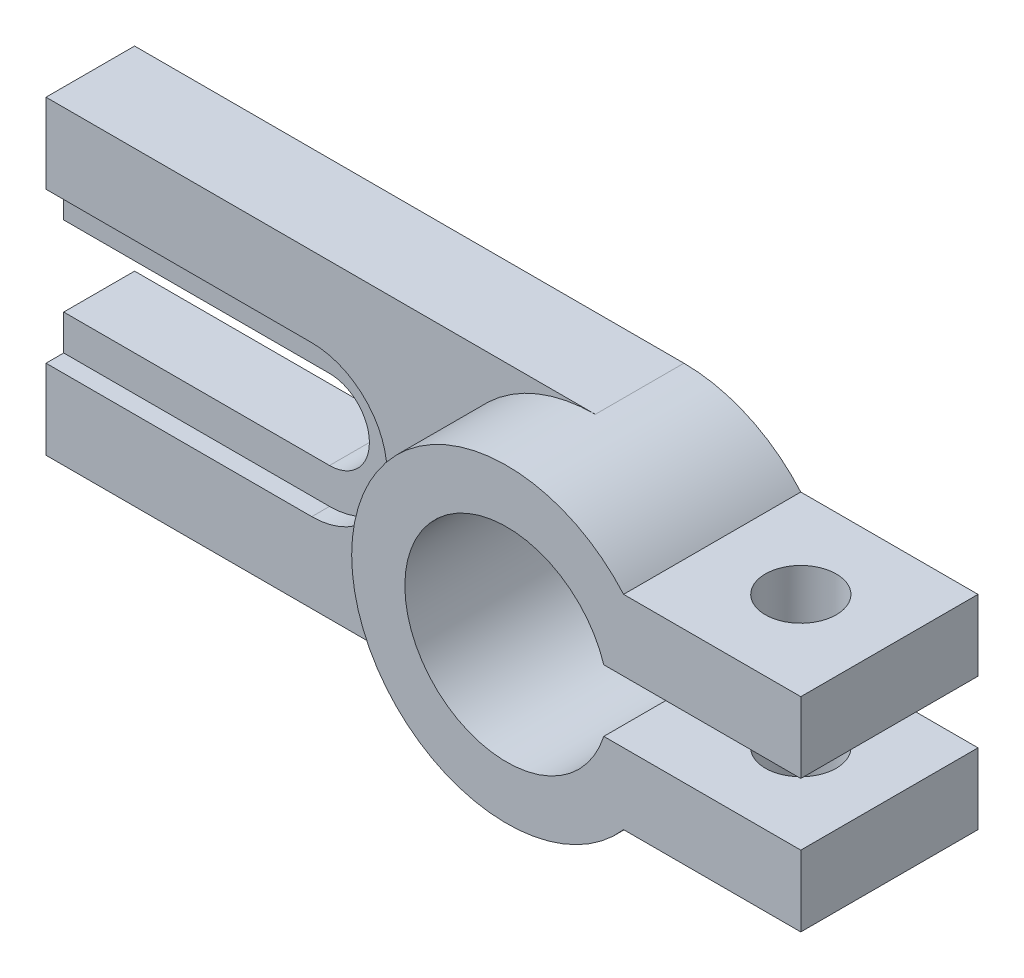
ISO-10303-21;
HEADER;
FILE_DESCRIPTION(('STEP AP214'),'2;1');
FILE_NAME('part.step','',(''),(''),'','','');
FILE_SCHEMA(('AUTOMOTIVE_DESIGN { 1 0 10303 214 1 1 1 1 }'));
ENDSEC;
DATA;
#1=APPLICATION_CONTEXT('core data for automotive mechanical design processes');
#2=APPLICATION_PROTOCOL_DEFINITION('international standard','automotive_design',2000,#1);
#3=PRODUCT_CONTEXT('',#1,'mechanical');
#4=PRODUCT('Part','Part','',(#3));
#5=PRODUCT_RELATED_PRODUCT_CATEGORY('part','',(#4));
#6=PRODUCT_DEFINITION_FORMATION('','',#4);
#7=PRODUCT_DEFINITION_CONTEXT('part definition',#1,'design');
#8=PRODUCT_DEFINITION('design','',#6,#7);
#9=PRODUCT_DEFINITION_SHAPE('','',#8);
#10=(LENGTH_UNIT() NAMED_UNIT(*) SI_UNIT(.MILLI.,.METRE.));
#11=(NAMED_UNIT(*) PLANE_ANGLE_UNIT() SI_UNIT($,.RADIAN.));
#12=(NAMED_UNIT(*) SI_UNIT($,.STERADIAN.) SOLID_ANGLE_UNIT());
#13=UNCERTAINTY_MEASURE_WITH_UNIT(LENGTH_MEASURE(1.E-05),#10,'distance_accuracy_value','');
#14=(GEOMETRIC_REPRESENTATION_CONTEXT(3) GLOBAL_UNCERTAINTY_ASSIGNED_CONTEXT((#13)) GLOBAL_UNIT_ASSIGNED_CONTEXT((#10,
#11,#12)) REPRESENTATION_CONTEXT('',''));
#15=CARTESIAN_POINT('',(0.,0.,0.));
#16=DIRECTION('',(0.,0.,1.));
#17=DIRECTION('',(1.,0.,0.));
#18=AXIS2_PLACEMENT_3D('',#15,#16,#17);
#19=CARTESIAN_POINT('',(0.,0.,10.));
#20=DIRECTION('',(0.,0.,-1.));
#21=DIRECTION('',(-1.,0.,0.));
#22=AXIS2_PLACEMENT_3D('',#19,#20,#21);
#23=PLANE('',#22);
#24=DIRECTION('',(0.,-1.,0.));
#25=VECTOR('',#24,1.);
#26=CARTESIAN_POINT('',(-62.,17.5,10.));
#27=LINE('',#26,#25);
#28=CARTESIAN_POINT('',(-62.,17.5,10.));
#29=VERTEX_POINT('',#28);
#30=CARTESIAN_POINT('',(-62.,8.5,10.));
#31=VERTEX_POINT('',#30);
#32=EDGE_CURVE('E121',#29,#31,#27,.T.);
#33=ORIENTED_EDGE('',*,*,#32,.T.);
#34=DIRECTION('',(-1.,0.,0.));
#35=VECTOR('',#34,1.);
#36=CARTESIAN_POINT('',(-62.,8.5,10.));
#37=LINE('',#36,#35);
#38=CARTESIAN_POINT('',(-32.,8.5,10.));
#39=VERTEX_POINT('',#38);
#40=EDGE_CURVE('E186',#39,#31,#37,.T.);
#41=ORIENTED_EDGE('',*,*,#40,.F.);
#42=CARTESIAN_POINT('',(-32.,0.,10.));
#43=DIRECTION('',(0.,0.,1.));
#44=DIRECTION('',(1.,0.,0.));
#45=AXIS2_PLACEMENT_3D('',#42,#43,#44);
#46=CIRCLE('',#45,8.5);
#47=CARTESIAN_POINT('',(-32.,-8.5,10.));
#48=VERTEX_POINT('',#47);
#49=EDGE_CURVE('E343',#48,#39,#46,.T.);
#50=ORIENTED_EDGE('',*,*,#49,.F.);
#51=DIRECTION('',(1.,0.,0.));
#52=VECTOR('',#51,1.);
#53=CARTESIAN_POINT('',(-62.,-8.5,10.));
#54=LINE('',#53,#52);
#55=CARTESIAN_POINT('',(-62.,-8.5,10.));
#56=VERTEX_POINT('',#55);
#57=EDGE_CURVE('E346',#56,#48,#54,.T.);
#58=ORIENTED_EDGE('',*,*,#57,.F.);
#59=DIRECTION('',(0.,-1.,0.));
#60=VECTOR('',#59,1.);
#61=CARTESIAN_POINT('',(-62.,-4.5,10.));
#62=LINE('',#61,#60);
#63=CARTESIAN_POINT('',(-62.,-17.5,10.));
#64=VERTEX_POINT('',#63);
#65=EDGE_CURVE('E338',#56,#64,#62,.T.);
#66=ORIENTED_EDGE('',*,*,#65,.T.);
#67=DIRECTION('',(1.,0.,0.));
#68=VECTOR('',#67,1.);
#69=CARTESIAN_POINT('',(-62.,-17.5,10.));
#70=LINE('',#69,#68);
#71=CARTESIAN_POINT('',(0.,-17.5,10.));
#72=VERTEX_POINT('',#71);
#73=EDGE_CURVE('E231',#64,#72,#70,.T.);
#74=ORIENTED_EDGE('',*,*,#73,.T.);
#75=CARTESIAN_POINT('',(0.,0.,10.));
#76=DIRECTION('',(0.,0.,1.));
#77=DIRECTION('',(1.,0.,0.));
#78=AXIS2_PLACEMENT_3D('',#75,#76,#77);
#79=CIRCLE('',#78,17.5);
#80=CARTESIAN_POINT('',(0.,17.5,10.));
#81=VERTEX_POINT('',#80);
#82=EDGE_CURVE('E11',#81,#72,#79,.T.);
#83=ORIENTED_EDGE('',*,*,#82,.F.);
#84=DIRECTION('',(-1.,0.,0.));
#85=VECTOR('',#84,1.);
#86=CARTESIAN_POINT('',(-62.,17.5,10.));
#87=LINE('',#86,#85);
#88=EDGE_CURVE('E260',#81,#29,#87,.T.);
#89=ORIENTED_EDGE('',*,*,#88,.T.);
#90=EDGE_LOOP('',(#33,#41,#50,#58,#66,#74,#83,#89));
#91=FACE_BOUND('',#90,.T.);
#92=ADVANCED_FACE('F32',(#91),#23,.F.);
#93=CARTESIAN_POINT('',(-62.,17.5,10.));
#94=DIRECTION('',(0.,-1.,0.));
#95=DIRECTION('',(0.,0.,-1.));
#96=AXIS2_PLACEMENT_3D('',#93,#94,#95);
#97=PLANE('',#96);
#98=DIRECTION('',(-1.,0.,0.));
#99=VECTOR('',#98,1.);
#100=CARTESIAN_POINT('',(-62.,17.5,0.));
#101=LINE('',#100,#99);
#102=CARTESIAN_POINT('',(0.,17.5,0.));
#103=VERTEX_POINT('',#102);
#104=CARTESIAN_POINT('',(-62.,17.5,0.));
#105=VERTEX_POINT('',#104);
#106=EDGE_CURVE('E220',#103,#105,#101,.T.);
#107=ORIENTED_EDGE('',*,*,#106,.T.);
#108=DIRECTION('',(0.,0.,-1.));
#109=VECTOR('',#108,1.);
#110=CARTESIAN_POINT('',(-62.,17.5,10.));
#111=LINE('',#110,#109);
#112=EDGE_CURVE('E41',#29,#105,#111,.T.);
#113=ORIENTED_EDGE('',*,*,#112,.F.);
#114=ORIENTED_EDGE('',*,*,#88,.F.);
#115=DIRECTION('',(0.,0.,-1.));
#116=VECTOR('',#115,1.);
#117=CARTESIAN_POINT('',(0.,17.5,10.));
#118=LINE('',#117,#116);
#119=EDGE_CURVE('E221',#81,#103,#118,.T.);
#120=ORIENTED_EDGE('',*,*,#119,.T.);
#121=EDGE_LOOP('',(#107,#113,#114,#120));
#122=FACE_BOUND('',#121,.T.);
#123=ADVANCED_FACE('F34',(#122),#97,.F.);
#124=CARTESIAN_POINT('',(-62.,17.5,10.));
#125=DIRECTION('',(1.,0.,0.));
#126=DIRECTION('',(0.,0.,-1.));
#127=AXIS2_PLACEMENT_3D('',#124,#125,#126);
#128=PLANE('',#127);
#129=DIRECTION('',(0.,-1.,0.));
#130=VECTOR('',#129,1.);
#131=CARTESIAN_POINT('',(-62.,4.5,8.));
#132=LINE('',#131,#130);
#133=CARTESIAN_POINT('',(-62.,8.5,8.));
#134=VERTEX_POINT('',#133);
#135=CARTESIAN_POINT('',(-62.,4.5,8.));
#136=VERTEX_POINT('',#135);
#137=EDGE_CURVE('E356',#134,#136,#132,.T.);
#138=ORIENTED_EDGE('',*,*,#137,.F.);
#139=DIRECTION('',(0.,0.,1.));
#140=VECTOR('',#139,1.);
#141=CARTESIAN_POINT('',(-62.,8.5,8.));
#142=LINE('',#141,#140);
#143=EDGE_CURVE('E318',#134,#31,#142,.T.);
#144=ORIENTED_EDGE('',*,*,#143,.T.);
#145=ORIENTED_EDGE('',*,*,#32,.F.);
#146=ORIENTED_EDGE('',*,*,#112,.T.);
#147=DIRECTION('',(0.,-1.,0.));
#148=VECTOR('',#147,1.);
#149=CARTESIAN_POINT('',(-62.,17.5,0.));
#150=LINE('',#149,#148);
#151=CARTESIAN_POINT('',(-62.,4.5,0.));
#152=VERTEX_POINT('',#151);
#153=EDGE_CURVE('E215',#105,#152,#150,.T.);
#154=ORIENTED_EDGE('',*,*,#153,.T.);
#155=DIRECTION('',(0.,0.,-1.));
#156=VECTOR('',#155,1.);
#157=CARTESIAN_POINT('',(-62.,4.5,10.));
#158=LINE('',#157,#156);
#159=EDGE_CURVE('E203',#136,#152,#158,.T.);
#160=ORIENTED_EDGE('',*,*,#159,.F.);
#161=EDGE_LOOP('',(#138,#144,#145,#146,#154,#160));
#162=FACE_BOUND('',#161,.T.);
#163=ADVANCED_FACE('F213',(#162),#128,.F.);
#164=CARTESIAN_POINT('',(-62.,4.5,10.));
#165=DIRECTION('',(0.,1.,0.));
#166=DIRECTION('',(0.,0.,1.));
#167=AXIS2_PLACEMENT_3D('',#164,#165,#166);
#168=PLANE('',#167);
#169=DIRECTION('',(0.,0.,-1.));
#170=VECTOR('',#169,1.);
#171=CARTESIAN_POINT('',(-32.,4.5,10.));
#172=LINE('',#171,#170);
#173=CARTESIAN_POINT('',(-32.,4.5,8.));
#174=VERTEX_POINT('',#173);
#175=CARTESIAN_POINT('',(-32.,4.5,0.));
#176=VERTEX_POINT('',#175);
#177=EDGE_CURVE('E201',#174,#176,#172,.T.);
#178=ORIENTED_EDGE('',*,*,#177,.F.);
#179=DIRECTION('',(1.,0.,0.));
#180=VECTOR('',#179,1.);
#181=CARTESIAN_POINT('',(-32.,4.5,8.));
#182=LINE('',#181,#180);
#183=EDGE_CURVE('E182',#136,#174,#182,.T.);
#184=ORIENTED_EDGE('',*,*,#183,.F.);
#185=ORIENTED_EDGE('',*,*,#159,.T.);
#186=DIRECTION('',(1.,0.,0.));
#187=VECTOR('',#186,1.);
#188=CARTESIAN_POINT('',(-62.,4.5,0.));
#189=LINE('',#188,#187);
#190=EDGE_CURVE('E225',#152,#176,#189,.T.);
#191=ORIENTED_EDGE('',*,*,#190,.T.);
#192=EDGE_LOOP('',(#178,#184,#185,#191));
#193=FACE_BOUND('',#192,.T.);
#194=ADVANCED_FACE('F380',(#193),#168,.F.);
#195=CARTESIAN_POINT('',(-32.,0.,10.));
#196=DIRECTION('',(0.,0.,-1.));
#197=DIRECTION('',(-1.,0.,0.));
#198=AXIS2_PLACEMENT_3D('',#195,#196,#197);
#199=CYLINDRICAL_SURFACE('',#198,4.5);
#200=DIRECTION('',(0.,0.,-1.));
#201=VECTOR('',#200,1.);
#202=CARTESIAN_POINT('',(-32.,-4.5,10.));
#203=LINE('',#202,#201);
#204=CARTESIAN_POINT('',(-32.,-4.5,8.));
#205=VERTEX_POINT('',#204);
#206=CARTESIAN_POINT('',(-32.,-4.5,0.));
#207=VERTEX_POINT('',#206);
#208=EDGE_CURVE('E192',#205,#207,#203,.T.);
#209=ORIENTED_EDGE('',*,*,#208,.F.);
#210=CARTESIAN_POINT('',(-32.,0.,8.));
#211=DIRECTION('',(0.,0.,-1.));
#212=DIRECTION('',(-1.,0.,0.));
#213=AXIS2_PLACEMENT_3D('',#210,#211,#212);
#214=CIRCLE('',#213,4.5);
#215=EDGE_CURVE('E179',#174,#205,#214,.T.);
#216=ORIENTED_EDGE('',*,*,#215,.F.);
#217=ORIENTED_EDGE('',*,*,#177,.T.);
#218=CARTESIAN_POINT('',(-32.,0.,0.));
#219=DIRECTION('',(0.,0.,-1.));
#220=DIRECTION('',(-1.,0.,0.));
#221=AXIS2_PLACEMENT_3D('',#218,#219,#220);
#222=CIRCLE('',#221,4.5);
#223=EDGE_CURVE('E199',#176,#207,#222,.T.);
#224=ORIENTED_EDGE('',*,*,#223,.T.);
#225=EDGE_LOOP('',(#209,#216,#217,#224));
#226=FACE_BOUND('',#225,.T.);
#227=ADVANCED_FACE('F197',(#226),#199,.F.);
#228=CARTESIAN_POINT('',(-32.,-4.5,10.));
#229=DIRECTION('',(0.,-1.,0.));
#230=DIRECTION('',(1.,0.,0.));
#231=AXIS2_PLACEMENT_3D('',#228,#229,#230);
#232=PLANE('',#231);
#233=DIRECTION('',(0.,0.,-1.));
#234=VECTOR('',#233,1.);
#235=CARTESIAN_POINT('',(-62.,-4.5,10.));
#236=LINE('',#235,#234);
#237=CARTESIAN_POINT('',(-62.,-4.5,8.));
#238=VERTEX_POINT('',#237);
#239=CARTESIAN_POINT('',(-62.,-4.5,0.));
#240=VERTEX_POINT('',#239);
#241=EDGE_CURVE('E194',#238,#240,#236,.T.);
#242=ORIENTED_EDGE('',*,*,#241,.F.);
#243=DIRECTION('',(-1.,0.,0.));
#244=VECTOR('',#243,1.);
#245=CARTESIAN_POINT('',(-32.,-4.5,8.));
#246=LINE('',#245,#244);
#247=EDGE_CURVE('E49',#205,#238,#246,.T.);
#248=ORIENTED_EDGE('',*,*,#247,.F.);
#249=ORIENTED_EDGE('',*,*,#208,.T.);
#250=DIRECTION('',(-1.,0.,0.));
#251=VECTOR('',#250,1.);
#252=CARTESIAN_POINT('',(-32.,-4.5,0.));
#253=LINE('',#252,#251);
#254=EDGE_CURVE('E237',#207,#240,#253,.T.);
#255=ORIENTED_EDGE('',*,*,#254,.T.);
#256=EDGE_LOOP('',(#242,#248,#249,#255));
#257=FACE_BOUND('',#256,.T.);
#258=ADVANCED_FACE('F190',(#257),#232,.F.);
#259=CARTESIAN_POINT('',(-62.,-4.5,10.));
#260=DIRECTION('',(1.,0.,0.));
#261=DIRECTION('',(0.,0.,-1.));
#262=AXIS2_PLACEMENT_3D('',#259,#260,#261);
#263=PLANE('',#262);
#264=ORIENTED_EDGE('',*,*,#65,.F.);
#265=DIRECTION('',(0.,0.,1.));
#266=VECTOR('',#265,1.);
#267=CARTESIAN_POINT('',(-62.,-8.5,8.));
#268=LINE('',#267,#266);
#269=CARTESIAN_POINT('',(-62.,-8.5,8.));
#270=VERTEX_POINT('',#269);
#271=EDGE_CURVE('E323',#270,#56,#268,.T.);
#272=ORIENTED_EDGE('',*,*,#271,.F.);
#273=DIRECTION('',(0.,-1.,0.));
#274=VECTOR('',#273,1.);
#275=CARTESIAN_POINT('',(-62.,-4.5,8.));
#276=LINE('',#275,#274);
#277=EDGE_CURVE('E195',#238,#270,#276,.T.);
#278=ORIENTED_EDGE('',*,*,#277,.F.);
#279=ORIENTED_EDGE('',*,*,#241,.T.);
#280=DIRECTION('',(0.,-1.,0.));
#281=VECTOR('',#280,1.);
#282=CARTESIAN_POINT('',(-62.,-4.5,0.));
#283=LINE('',#282,#281);
#284=CARTESIAN_POINT('',(-62.,-17.5,0.));
#285=VERTEX_POINT('',#284);
#286=EDGE_CURVE('E239',#240,#285,#283,.T.);
#287=ORIENTED_EDGE('',*,*,#286,.T.);
#288=DIRECTION('',(0.,0.,-1.));
#289=VECTOR('',#288,1.);
#290=CARTESIAN_POINT('',(-62.,-17.5,10.));
#291=LINE('',#290,#289);
#292=EDGE_CURVE('E205',#64,#285,#291,.T.);
#293=ORIENTED_EDGE('',*,*,#292,.F.);
#294=EDGE_LOOP('',(#264,#272,#278,#279,#287,#293));
#295=FACE_BOUND('',#294,.T.);
#296=ADVANCED_FACE('F428',(#295),#263,.F.);
#297=CARTESIAN_POINT('',(-62.,-17.5,10.));
#298=DIRECTION('',(0.,1.,0.));
#299=DIRECTION('',(-1.,0.,0.));
#300=AXIS2_PLACEMENT_3D('',#297,#298,#299);
#301=PLANE('',#300);
#302=DIRECTION('',(1.,0.,0.));
#303=VECTOR('',#302,1.);
#304=CARTESIAN_POINT('',(-62.,-17.5,0.));
#305=LINE('',#304,#303);
#306=CARTESIAN_POINT('',(0.,-17.5,0.));
#307=VERTEX_POINT('',#306);
#308=EDGE_CURVE('E241',#285,#307,#305,.T.);
#309=ORIENTED_EDGE('',*,*,#308,.T.);
#310=DIRECTION('',(0.,0.,-1.));
#311=VECTOR('',#310,1.);
#312=CARTESIAN_POINT('',(0.,-17.5,10.));
#313=LINE('',#312,#311);
#314=EDGE_CURVE('E285',#72,#307,#313,.T.);
#315=ORIENTED_EDGE('',*,*,#314,.F.);
#316=ORIENTED_EDGE('',*,*,#73,.F.);
#317=ORIENTED_EDGE('',*,*,#292,.T.);
#318=EDGE_LOOP('',(#309,#315,#316,#317));
#319=FACE_BOUND('',#318,.T.);
#320=ADVANCED_FACE('F292',(#319),#301,.F.);
#321=CARTESIAN_POINT('',(33.1909059582729,-11.5,10.));
#322=DIRECTION('',(0.,1.,0.));
#323=DIRECTION('',(-1.,0.,0.));
#324=AXIS2_PLACEMENT_3D('',#321,#322,#323);
#325=PLANE('',#324);
#326=CARTESIAN_POINT('',(23.1909059582729,-11.5,10.));
#327=DIRECTION('',(0.,-1.,0.));
#328=DIRECTION('',(1.,0.,0.));
#329=AXIS2_PLACEMENT_3D('',#326,#327,#328);
#330=CIRCLE('',#329,4.00000000000001);
#331=CARTESIAN_POINT('',(27.1909059582729,-11.5,10.));
#332=VERTEX_POINT('',#331);
#333=EDGE_CURVE('E620',#332,#332,#330,.T.);
#334=ORIENTED_EDGE('',*,*,#333,.F.);
#335=EDGE_LOOP('',(#334));
#336=FACE_BOUND('',#335,.T.);
#337=DIRECTION('',(1.,0.,0.));
#338=VECTOR('',#337,1.);
#339=CARTESIAN_POINT('',(33.1909059582729,-11.5,0.));
#340=LINE('',#339,#338);
#341=CARTESIAN_POINT('',(13.1909059582729,-11.5,0.));
#342=VERTEX_POINT('',#341);
#343=CARTESIAN_POINT('',(33.1909059582729,-11.5,0.));
#344=VERTEX_POINT('',#343);
#345=EDGE_CURVE('E245',#342,#344,#340,.T.);
#346=ORIENTED_EDGE('',*,*,#345,.T.);
#347=DIRECTION('',(0.,0.,-1.));
#348=VECTOR('',#347,1.);
#349=CARTESIAN_POINT('',(33.1909059582729,-11.5,10.));
#350=LINE('',#349,#348);
#351=CARTESIAN_POINT('',(33.1909059582729,-11.5,20.));
#352=VERTEX_POINT('',#351);
#353=EDGE_CURVE('E279',#352,#344,#350,.T.);
#354=ORIENTED_EDGE('',*,*,#353,.F.);
#355=DIRECTION('',(1.,0.,0.));
#356=VECTOR('',#355,1.);
#357=CARTESIAN_POINT('',(33.1909059582729,-11.5,20.));
#358=LINE('',#357,#356);
#359=CARTESIAN_POINT('',(13.1909059582729,-11.5,20.));
#360=VERTEX_POINT('',#359);
#361=EDGE_CURVE('E307',#360,#352,#358,.T.);
#362=ORIENTED_EDGE('',*,*,#361,.F.);
#363=DIRECTION('',(0.,0.,-1.));
#364=VECTOR('',#363,1.);
#365=CARTESIAN_POINT('',(13.1909059582729,-11.5,10.));
#366=LINE('',#365,#364);
#367=EDGE_CURVE('E282',#360,#342,#366,.T.);
#368=ORIENTED_EDGE('',*,*,#367,.T.);
#369=EDGE_LOOP('',(#346,#354,#362,#368));
#370=FACE_BOUND('',#369,.T.);
#371=ADVANCED_FACE('F305',(#336,#370),#325,.F.);
#372=CARTESIAN_POINT('',(33.1909059582729,-3.5,10.));
#373=DIRECTION('',(-1.,0.,0.));
#374=DIRECTION('',(0.,0.,1.));
#375=AXIS2_PLACEMENT_3D('',#372,#373,#374);
#376=PLANE('',#375);
#377=DIRECTION('',(0.,1.,0.));
#378=VECTOR('',#377,1.);
#379=CARTESIAN_POINT('',(33.1909059582729,-3.5,0.));
#380=LINE('',#379,#378);
#381=CARTESIAN_POINT('',(33.1909059582729,-3.5,0.));
#382=VERTEX_POINT('',#381);
#383=EDGE_CURVE('E247',#344,#382,#380,.T.);
#384=ORIENTED_EDGE('',*,*,#383,.T.);
#385=DIRECTION('',(0.,0.,-1.));
#386=VECTOR('',#385,1.);
#387=CARTESIAN_POINT('',(33.1909059582729,-3.5,10.));
#388=LINE('',#387,#386);
#389=CARTESIAN_POINT('',(33.1909059582729,-3.5,20.));
#390=VERTEX_POINT('',#389);
#391=EDGE_CURVE('E276',#390,#382,#388,.T.);
#392=ORIENTED_EDGE('',*,*,#391,.F.);
#393=DIRECTION('',(0.,1.,0.));
#394=VECTOR('',#393,1.);
#395=CARTESIAN_POINT('',(33.1909059582729,-3.5,20.));
#396=LINE('',#395,#394);
#397=EDGE_CURVE('E312',#352,#390,#396,.T.);
#398=ORIENTED_EDGE('',*,*,#397,.F.);
#399=ORIENTED_EDGE('',*,*,#353,.T.);
#400=EDGE_LOOP('',(#384,#392,#398,#399));
#401=FACE_BOUND('',#400,.T.);
#402=ADVANCED_FACE('F419',(#401),#376,.F.);
#403=CARTESIAN_POINT('',(10.9544511501033,-3.5,10.));
#404=DIRECTION('',(0.,-1.,0.));
#405=DIRECTION('',(0.,0.,-1.));
#406=AXIS2_PLACEMENT_3D('',#403,#404,#405);
#407=PLANE('',#406);
#408=CARTESIAN_POINT('',(23.1909059582729,-3.5,10.));
#409=DIRECTION('',(0.,-1.,0.));
#410=DIRECTION('',(0.,0.,-1.));
#411=AXIS2_PLACEMENT_3D('',#408,#409,#410);
#412=CIRCLE('',#411,4.00000000000001);
#413=CARTESIAN_POINT('',(23.1909059582729,-3.5,5.99999999999999));
#414=VERTEX_POINT('',#413);
#415=EDGE_CURVE('E361',#414,#414,#412,.T.);
#416=ORIENTED_EDGE('',*,*,#415,.T.);
#417=EDGE_LOOP('',(#416));
#418=FACE_BOUND('',#417,.T.);
#419=DIRECTION('',(-1.,0.,0.));
#420=VECTOR('',#419,1.);
#421=CARTESIAN_POINT('',(10.9544511501033,-3.5,0.));
#422=LINE('',#421,#420);
#423=CARTESIAN_POINT('',(10.9544511501033,-3.5,0.));
#424=VERTEX_POINT('',#423);
#425=EDGE_CURVE('E249',#382,#424,#422,.T.);
#426=ORIENTED_EDGE('',*,*,#425,.T.);
#427=DIRECTION('',(0.,0.,-1.));
#428=VECTOR('',#427,1.);
#429=CARTESIAN_POINT('',(10.9544511501033,-3.5,10.));
#430=LINE('',#429,#428);
#431=CARTESIAN_POINT('',(10.9544511501033,-3.5,20.));
#432=VERTEX_POINT('',#431);
#433=EDGE_CURVE('E273',#432,#424,#430,.T.);
#434=ORIENTED_EDGE('',*,*,#433,.F.);
#435=DIRECTION('',(-1.,0.,0.));
#436=VECTOR('',#435,1.);
#437=CARTESIAN_POINT('',(10.9544511501033,-3.5,20.));
#438=LINE('',#437,#436);
#439=EDGE_CURVE('E327',#390,#432,#438,.T.);
#440=ORIENTED_EDGE('',*,*,#439,.F.);
#441=ORIENTED_EDGE('',*,*,#391,.T.);
#442=EDGE_LOOP('',(#426,#434,#440,#441));
#443=FACE_BOUND('',#442,.T.);
#444=ADVANCED_FACE('F415',(#418,#443),#407,.F.);
#445=CARTESIAN_POINT('',(0.,0.,10.));
#446=DIRECTION('',(0.,0.,-1.));
#447=DIRECTION('',(-1.,0.,0.));
#448=AXIS2_PLACEMENT_3D('',#445,#446,#447);
#449=CYLINDRICAL_SURFACE('',#448,11.5);
#450=CARTESIAN_POINT('',(0.,0.,0.));
#451=DIRECTION('',(0.,0.,-1.));
#452=DIRECTION('',(1.,0.,0.));
#453=AXIS2_PLACEMENT_3D('',#450,#451,#452);
#454=CIRCLE('',#453,11.5);
#455=CARTESIAN_POINT('',(10.9544511501033,3.5,0.));
#456=VERTEX_POINT('',#455);
#457=EDGE_CURVE('E251',#424,#456,#454,.T.);
#458=ORIENTED_EDGE('',*,*,#457,.T.);
#459=DIRECTION('',(0.,0.,-1.));
#460=VECTOR('',#459,1.);
#461=CARTESIAN_POINT('',(10.9544511501033,3.5,10.));
#462=LINE('',#461,#460);
#463=CARTESIAN_POINT('',(10.9544511501033,3.5,20.));
#464=VERTEX_POINT('',#463);
#465=EDGE_CURVE('E270',#464,#456,#462,.T.);
#466=ORIENTED_EDGE('',*,*,#465,.F.);
#467=CARTESIAN_POINT('',(0.,0.,20.));
#468=DIRECTION('',(0.,0.,-1.));
#469=DIRECTION('',(1.,0.,0.));
#470=AXIS2_PLACEMENT_3D('',#467,#468,#469);
#471=CIRCLE('',#470,11.5);
#472=EDGE_CURVE('E330',#432,#464,#471,.T.);
#473=ORIENTED_EDGE('',*,*,#472,.F.);
#474=ORIENTED_EDGE('',*,*,#433,.T.);
#475=EDGE_LOOP('',(#458,#466,#473,#474));
#476=FACE_BOUND('',#475,.T.);
#477=ADVANCED_FACE('F411',(#476),#449,.F.);
#478=CARTESIAN_POINT('',(33.1909059582729,3.5,10.));
#479=DIRECTION('',(0.,1.,0.));
#480=DIRECTION('',(-1.,0.,0.));
#481=AXIS2_PLACEMENT_3D('',#478,#479,#480);
#482=PLANE('',#481);
#483=CARTESIAN_POINT('',(23.1909059582729,3.5,10.));
#484=DIRECTION('',(0.,1.,0.));
#485=DIRECTION('',(-1.,0.,0.));
#486=AXIS2_PLACEMENT_3D('',#483,#484,#485);
#487=CIRCLE('',#486,4.00000000000001);
#488=CARTESIAN_POINT('',(19.1909059582729,3.5,10.));
#489=VERTEX_POINT('',#488);
#490=EDGE_CURVE('E363',#489,#489,#487,.T.);
#491=ORIENTED_EDGE('',*,*,#490,.T.);
#492=EDGE_LOOP('',(#491));
#493=FACE_BOUND('',#492,.T.);
#494=DIRECTION('',(1.,0.,0.));
#495=VECTOR('',#494,1.);
#496=CARTESIAN_POINT('',(33.1909059582729,3.5,0.));
#497=LINE('',#496,#495);
#498=CARTESIAN_POINT('',(33.1909059582729,3.5,0.));
#499=VERTEX_POINT('',#498);
#500=EDGE_CURVE('E253',#456,#499,#497,.T.);
#501=ORIENTED_EDGE('',*,*,#500,.T.);
#502=DIRECTION('',(0.,0.,-1.));
#503=VECTOR('',#502,1.);
#504=CARTESIAN_POINT('',(33.1909059582729,3.5,10.));
#505=LINE('',#504,#503);
#506=CARTESIAN_POINT('',(33.1909059582729,3.5,20.));
#507=VERTEX_POINT('',#506);
#508=EDGE_CURVE('E267',#507,#499,#505,.T.);
#509=ORIENTED_EDGE('',*,*,#508,.F.);
#510=DIRECTION('',(1.,0.,0.));
#511=VECTOR('',#510,1.);
#512=CARTESIAN_POINT('',(33.1909059582729,3.5,20.));
#513=LINE('',#512,#511);
#514=EDGE_CURVE('E333',#464,#507,#513,.T.);
#515=ORIENTED_EDGE('',*,*,#514,.F.);
#516=ORIENTED_EDGE('',*,*,#465,.T.);
#517=EDGE_LOOP('',(#501,#509,#515,#516));
#518=FACE_BOUND('',#517,.T.);
#519=ADVANCED_FACE('F407',(#493,#518),#482,.F.);
#520=CARTESIAN_POINT('',(33.1909059582729,11.5,10.));
#521=DIRECTION('',(-1.,0.,0.));
#522=DIRECTION('',(0.,0.,1.));
#523=AXIS2_PLACEMENT_3D('',#520,#521,#522);
#524=PLANE('',#523);
#525=DIRECTION('',(0.,1.,0.));
#526=VECTOR('',#525,1.);
#527=CARTESIAN_POINT('',(33.1909059582729,11.5,0.));
#528=LINE('',#527,#526);
#529=CARTESIAN_POINT('',(33.1909059582729,11.5,0.));
#530=VERTEX_POINT('',#529);
#531=EDGE_CURVE('E255',#499,#530,#528,.T.);
#532=ORIENTED_EDGE('',*,*,#531,.T.);
#533=DIRECTION('',(0.,0.,-1.));
#534=VECTOR('',#533,1.);
#535=CARTESIAN_POINT('',(33.1909059582729,11.5,10.));
#536=LINE('',#535,#534);
#537=CARTESIAN_POINT('',(33.1909059582729,11.5,20.));
#538=VERTEX_POINT('',#537);
#539=EDGE_CURVE('E264',#538,#530,#536,.T.);
#540=ORIENTED_EDGE('',*,*,#539,.F.);
#541=DIRECTION('',(0.,1.,0.));
#542=VECTOR('',#541,1.);
#543=CARTESIAN_POINT('',(33.1909059582729,11.5,20.));
#544=LINE('',#543,#542);
#545=EDGE_CURVE('E228',#507,#538,#544,.T.);
#546=ORIENTED_EDGE('',*,*,#545,.F.);
#547=ORIENTED_EDGE('',*,*,#508,.T.);
#548=EDGE_LOOP('',(#532,#540,#546,#547));
#549=FACE_BOUND('',#548,.T.);
#550=ADVANCED_FACE('F403',(#549),#524,.F.);
#551=CARTESIAN_POINT('',(13.1909059582729,11.5,10.));
#552=DIRECTION('',(0.,-1.,0.));
#553=DIRECTION('',(1.,0.,0.));
#554=AXIS2_PLACEMENT_3D('',#551,#552,#553);
#555=PLANE('',#554);
#556=CARTESIAN_POINT('',(23.1909059582729,11.5,10.));
#557=DIRECTION('',(0.,-1.,0.));
#558=DIRECTION('',(1.,0.,0.));
#559=AXIS2_PLACEMENT_3D('',#556,#557,#558);
#560=CIRCLE('',#559,4.00000000000001);
#561=CARTESIAN_POINT('',(27.1909059582729,11.5,10.));
#562=VERTEX_POINT('',#561);
#563=EDGE_CURVE('E36',#562,#562,#560,.T.);
#564=ORIENTED_EDGE('',*,*,#563,.T.);
#565=EDGE_LOOP('',(#564));
#566=FACE_BOUND('',#565,.T.);
#567=DIRECTION('',(-1.,0.,0.));
#568=VECTOR('',#567,1.);
#569=CARTESIAN_POINT('',(13.1909059582729,11.5,0.));
#570=LINE('',#569,#568);
#571=CARTESIAN_POINT('',(13.1909059582729,11.5,0.));
#572=VERTEX_POINT('',#571);
#573=EDGE_CURVE('E257',#530,#572,#570,.T.);
#574=ORIENTED_EDGE('',*,*,#573,.T.);
#575=DIRECTION('',(0.,0.,-1.));
#576=VECTOR('',#575,1.);
#577=CARTESIAN_POINT('',(13.1909059582729,11.5,10.));
#578=LINE('',#577,#576);
#579=CARTESIAN_POINT('',(13.1909059582729,11.5,20.));
#580=VERTEX_POINT('',#579);
#581=EDGE_CURVE('E262',#580,#572,#578,.T.);
#582=ORIENTED_EDGE('',*,*,#581,.F.);
#583=DIRECTION('',(-1.,0.,0.));
#584=VECTOR('',#583,1.);
#585=CARTESIAN_POINT('',(13.1909059582729,11.5,20.));
#586=LINE('',#585,#584);
#587=EDGE_CURVE('E223',#538,#580,#586,.T.);
#588=ORIENTED_EDGE('',*,*,#587,.F.);
#589=ORIENTED_EDGE('',*,*,#539,.T.);
#590=EDGE_LOOP('',(#574,#582,#588,#589));
#591=FACE_BOUND('',#590,.T.);
#592=ADVANCED_FACE('F400',(#566,#591),#555,.F.);
#593=CARTESIAN_POINT('',(0.,0.,10.));
#594=DIRECTION('',(0.,0.,-1.));
#595=DIRECTION('',(-1.,0.,0.));
#596=AXIS2_PLACEMENT_3D('',#593,#594,#595);
#597=CYLINDRICAL_SURFACE('',#596,17.5);
#598=CARTESIAN_POINT('',(0.,0.,0.));
#599=DIRECTION('',(0.,0.,1.));
#600=DIRECTION('',(-1.,0.,0.));
#601=AXIS2_PLACEMENT_3D('',#598,#599,#600);
#602=CIRCLE('',#601,17.5);
#603=EDGE_CURVE('E113',#572,#103,#602,.T.);
#604=ORIENTED_EDGE('',*,*,#603,.T.);
#605=ORIENTED_EDGE('',*,*,#119,.F.);
#606=ORIENTED_EDGE('',*,*,#82,.T.);
#607=ORIENTED_EDGE('',*,*,#314,.T.);
#608=CARTESIAN_POINT('',(0.,0.,0.));
#609=DIRECTION('',(0.,0.,1.));
#610=DIRECTION('',(-1.,0.,0.));
#611=AXIS2_PLACEMENT_3D('',#608,#609,#610);
#612=CIRCLE('',#611,17.5);
#613=EDGE_CURVE('E243',#307,#342,#612,.T.);
#614=ORIENTED_EDGE('',*,*,#613,.T.);
#615=ORIENTED_EDGE('',*,*,#367,.F.);
#616=CARTESIAN_POINT('',(0.,0.,20.));
#617=DIRECTION('',(0.,0.,1.));
#618=DIRECTION('',(1.,0.,0.));
#619=AXIS2_PLACEMENT_3D('',#616,#617,#618);
#620=CIRCLE('',#619,17.5);
#621=EDGE_CURVE('E313',#580,#360,#620,.T.);
#622=ORIENTED_EDGE('',*,*,#621,.F.);
#623=ORIENTED_EDGE('',*,*,#581,.T.);
#624=EDGE_LOOP('',(#604,#605,#606,#607,#614,#615,#622,#623));
#625=FACE_BOUND('',#624,.T.);
#626=ADVANCED_FACE('F301',(#625),#597,.T.);
#627=CARTESIAN_POINT('',(0.,0.,0.));
#628=DIRECTION('',(0.,0.,-1.));
#629=DIRECTION('',(-1.,0.,0.));
#630=AXIS2_PLACEMENT_3D('',#627,#628,#629);
#631=PLANE('',#630);
#632=ORIENTED_EDGE('',*,*,#106,.F.);
#633=ORIENTED_EDGE('',*,*,#603,.F.);
#634=ORIENTED_EDGE('',*,*,#573,.F.);
#635=ORIENTED_EDGE('',*,*,#531,.F.);
#636=ORIENTED_EDGE('',*,*,#500,.F.);
#637=ORIENTED_EDGE('',*,*,#457,.F.);
#638=ORIENTED_EDGE('',*,*,#425,.F.);
#639=ORIENTED_EDGE('',*,*,#383,.F.);
#640=ORIENTED_EDGE('',*,*,#345,.F.);
#641=ORIENTED_EDGE('',*,*,#613,.F.);
#642=ORIENTED_EDGE('',*,*,#308,.F.);
#643=ORIENTED_EDGE('',*,*,#286,.F.);
#644=ORIENTED_EDGE('',*,*,#254,.F.);
#645=ORIENTED_EDGE('',*,*,#223,.F.);
#646=ORIENTED_EDGE('',*,*,#190,.F.);
#647=ORIENTED_EDGE('',*,*,#153,.F.);
#648=EDGE_LOOP('',(#632,#633,#634,#635,#636,#637,#638,#639,#640,#641,#642,#643,#644,#645,#646,#647));
#649=FACE_BOUND('',#648,.T.);
#650=ADVANCED_FACE('F298',(#649),#631,.T.);
#651=CARTESIAN_POINT('',(0.,0.,20.));
#652=DIRECTION('',(0.,0.,1.));
#653=DIRECTION('',(1.,0.,0.));
#654=AXIS2_PLACEMENT_3D('',#651,#652,#653);
#655=PLANE('',#654);
#656=ORIENTED_EDGE('',*,*,#621,.T.);
#657=ORIENTED_EDGE('',*,*,#361,.T.);
#658=ORIENTED_EDGE('',*,*,#397,.T.);
#659=ORIENTED_EDGE('',*,*,#439,.T.);
#660=ORIENTED_EDGE('',*,*,#472,.T.);
#661=ORIENTED_EDGE('',*,*,#514,.T.);
#662=ORIENTED_EDGE('',*,*,#545,.T.);
#663=ORIENTED_EDGE('',*,*,#587,.T.);
#664=EDGE_LOOP('',(#656,#657,#658,#659,#660,#661,#662,#663));
#665=FACE_BOUND('',#664,.T.);
#666=ADVANCED_FACE('F315',(#665),#655,.T.);
#667=CARTESIAN_POINT('',(-62.,8.5,8.));
#668=DIRECTION('',(0.,1.,0.));
#669=DIRECTION('',(-1.,0.,0.));
#670=AXIS2_PLACEMENT_3D('',#667,#668,#669);
#671=PLANE('',#670);
#672=ORIENTED_EDGE('',*,*,#40,.T.);
#673=ORIENTED_EDGE('',*,*,#143,.F.);
#674=DIRECTION('',(-1.,0.,0.));
#675=VECTOR('',#674,1.);
#676=CARTESIAN_POINT('',(-62.,8.5,8.));
#677=LINE('',#676,#675);
#678=CARTESIAN_POINT('',(-32.,8.5,8.));
#679=VERTEX_POINT('',#678);
#680=EDGE_CURVE('E358',#679,#134,#677,.T.);
#681=ORIENTED_EDGE('',*,*,#680,.F.);
#682=DIRECTION('',(0.,0.,1.));
#683=VECTOR('',#682,1.);
#684=CARTESIAN_POINT('',(-32.,8.5,8.));
#685=LINE('',#684,#683);
#686=EDGE_CURVE('E320',#679,#39,#685,.T.);
#687=ORIENTED_EDGE('',*,*,#686,.T.);
#688=EDGE_LOOP('',(#672,#673,#681,#687));
#689=FACE_BOUND('',#688,.T.);
#690=ADVANCED_FACE('F490',(#689),#671,.F.);
#691=CARTESIAN_POINT('',(-32.,0.,8.));
#692=DIRECTION('',(0.,0.,1.));
#693=DIRECTION('',(1.,0.,0.));
#694=AXIS2_PLACEMENT_3D('',#691,#692,#693);
#695=CYLINDRICAL_SURFACE('',#694,8.5);
#696=ORIENTED_EDGE('',*,*,#49,.T.);
#697=ORIENTED_EDGE('',*,*,#686,.F.);
#698=CARTESIAN_POINT('',(-32.,0.,8.));
#699=DIRECTION('',(0.,0.,1.));
#700=DIRECTION('',(1.,0.,0.));
#701=AXIS2_PLACEMENT_3D('',#698,#699,#700);
#702=CIRCLE('',#701,8.5);
#703=CARTESIAN_POINT('',(-32.,-8.5,8.));
#704=VERTEX_POINT('',#703);
#705=EDGE_CURVE('E375',#704,#679,#702,.T.);
#706=ORIENTED_EDGE('',*,*,#705,.F.);
#707=DIRECTION('',(0.,0.,1.));
#708=VECTOR('',#707,1.);
#709=CARTESIAN_POINT('',(-32.,-8.5,8.));
#710=LINE('',#709,#708);
#711=EDGE_CURVE('E350',#704,#48,#710,.T.);
#712=ORIENTED_EDGE('',*,*,#711,.T.);
#713=EDGE_LOOP('',(#696,#697,#706,#712));
#714=FACE_BOUND('',#713,.T.);
#715=ADVANCED_FACE('F495',(#714),#695,.F.);
#716=CARTESIAN_POINT('',(-62.,-8.5,8.));
#717=DIRECTION('',(0.,-1.,0.));
#718=DIRECTION('',(1.,0.,0.));
#719=AXIS2_PLACEMENT_3D('',#716,#717,#718);
#720=PLANE('',#719);
#721=ORIENTED_EDGE('',*,*,#57,.T.);
#722=ORIENTED_EDGE('',*,*,#711,.F.);
#723=DIRECTION('',(1.,0.,0.));
#724=VECTOR('',#723,1.);
#725=CARTESIAN_POINT('',(-62.,-8.5,8.));
#726=LINE('',#725,#724);
#727=EDGE_CURVE('E372',#270,#704,#726,.T.);
#728=ORIENTED_EDGE('',*,*,#727,.F.);
#729=ORIENTED_EDGE('',*,*,#271,.T.);
#730=EDGE_LOOP('',(#721,#722,#728,#729));
#731=FACE_BOUND('',#730,.T.);
#732=ADVANCED_FACE('F502',(#731),#720,.F.);
#733=CARTESIAN_POINT('',(-32.,0.,8.));
#734=DIRECTION('',(0.,0.,-1.));
#735=DIRECTION('',(-1.,0.,0.));
#736=AXIS2_PLACEMENT_3D('',#733,#734,#735);
#737=PLANE('',#736);
#738=ORIENTED_EDGE('',*,*,#215,.T.);
#739=ORIENTED_EDGE('',*,*,#247,.T.);
#740=ORIENTED_EDGE('',*,*,#277,.T.);
#741=ORIENTED_EDGE('',*,*,#727,.T.);
#742=ORIENTED_EDGE('',*,*,#705,.T.);
#743=ORIENTED_EDGE('',*,*,#680,.T.);
#744=ORIENTED_EDGE('',*,*,#137,.T.);
#745=ORIENTED_EDGE('',*,*,#183,.T.);
#746=EDGE_LOOP('',(#738,#739,#740,#741,#742,#743,#744,#745));
#747=FACE_BOUND('',#746,.T.);
#748=ADVANCED_FACE('F180',(#747),#737,.F.);
#749=CARTESIAN_POINT('',(23.1909059582729,17.5,10.));
#750=DIRECTION('',(0.,-1.,0.));
#751=DIRECTION('',(1.,0.,0.));
#752=AXIS2_PLACEMENT_3D('',#749,#750,#751);
#753=CYLINDRICAL_SURFACE('',#752,4.00000000000001);
#754=ORIENTED_EDGE('',*,*,#563,.F.);
#755=EDGE_LOOP('',(#754));
#756=FACE_BOUND('',#755,.T.);
#757=ORIENTED_EDGE('',*,*,#490,.F.);
#758=EDGE_LOOP('',(#757));
#759=FACE_BOUND('',#758,.T.);
#760=ADVANCED_FACE('F513',(#756,#759),#753,.F.);
#761=ORIENTED_EDGE('',*,*,#333,.T.);
#762=EDGE_LOOP('',(#761));
#763=FACE_BOUND('',#762,.T.);
#764=ORIENTED_EDGE('',*,*,#415,.F.);
#765=EDGE_LOOP('',(#764));
#766=FACE_BOUND('',#765,.T.);
#767=ADVANCED_FACE('F519',(#763,#766),#753,.F.);
#768=CLOSED_SHELL('',(#92,#123,#163,#194,#227,#258,#296,#320,#371,#402,#444,#477,#519,#550,#592,
#626,#650,#666,#690,#715,#732,#748,#760,#767));
#769=MANIFOLD_SOLID_BREP('B2',#768);
#770=ADVANCED_BREP_SHAPE_REPRESENTATION('',(#18,#769),#14);
#771=SHAPE_DEFINITION_REPRESENTATION(#9,#770);
ENDSEC;
END-ISO-10303-21;
